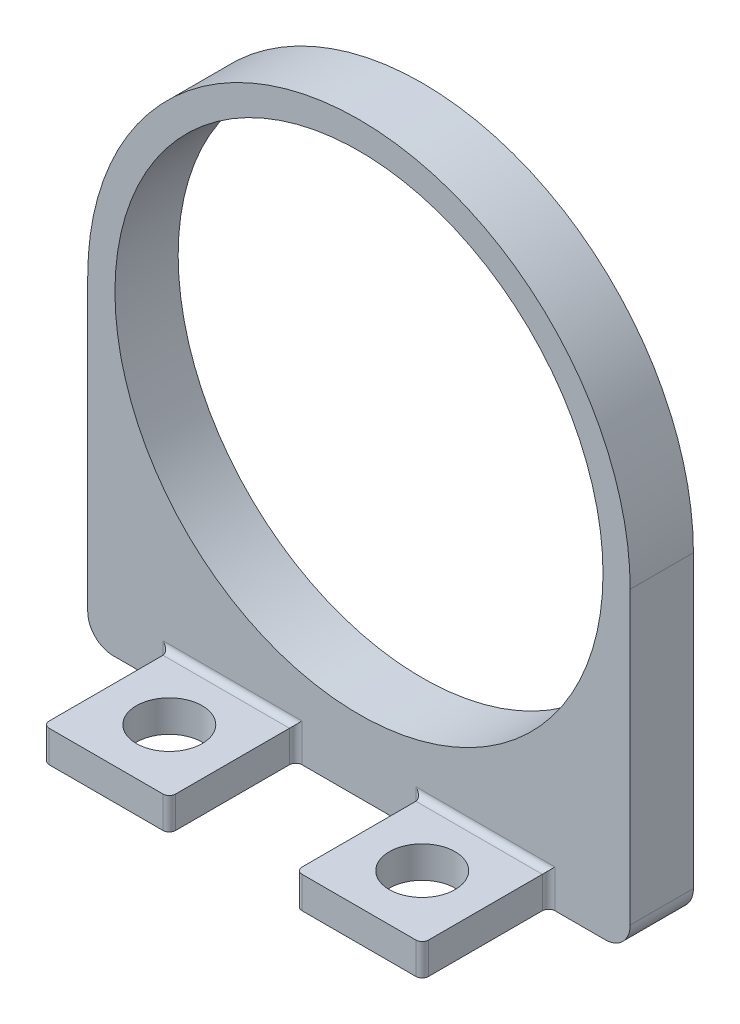
ISO-10303-21;
HEADER;
FILE_DESCRIPTION(('STEP AP214'),'2;1');
FILE_NAME('part.step','',(''),(''),'','','');
FILE_SCHEMA(('AUTOMOTIVE_DESIGN { 1 0 10303 214 1 1 1 1 }'));
ENDSEC;
DATA;
#1=APPLICATION_CONTEXT('core data for automotive mechanical design processes');
#2=APPLICATION_PROTOCOL_DEFINITION('international standard','automotive_design',2000,#1);
#3=PRODUCT_CONTEXT('',#1,'mechanical');
#4=PRODUCT('Part','Part','',(#3));
#5=PRODUCT_RELATED_PRODUCT_CATEGORY('part','',(#4));
#6=PRODUCT_DEFINITION_FORMATION('','',#4);
#7=PRODUCT_DEFINITION_CONTEXT('part definition',#1,'design');
#8=PRODUCT_DEFINITION('design','',#6,#7);
#9=PRODUCT_DEFINITION_SHAPE('','',#8);
#10=(LENGTH_UNIT() NAMED_UNIT(*) SI_UNIT(.MILLI.,.METRE.));
#11=(NAMED_UNIT(*) PLANE_ANGLE_UNIT() SI_UNIT($,.RADIAN.));
#12=(NAMED_UNIT(*) SI_UNIT($,.STERADIAN.) SOLID_ANGLE_UNIT());
#13=UNCERTAINTY_MEASURE_WITH_UNIT(LENGTH_MEASURE(1.E-05),#10,'distance_accuracy_value','');
#14=(GEOMETRIC_REPRESENTATION_CONTEXT(3) GLOBAL_UNCERTAINTY_ASSIGNED_CONTEXT((#13)) GLOBAL_UNIT_ASSIGNED_CONTEXT((#10,
#11,#12)) REPRESENTATION_CONTEXT('',''));
#15=CARTESIAN_POINT('',(0.,0.,0.));
#16=DIRECTION('',(0.,0.,1.));
#17=DIRECTION('',(1.,0.,0.));
#18=AXIS2_PLACEMENT_3D('',#15,#16,#17);
#19=CARTESIAN_POINT('',(0.,0.,6.35));
#20=DIRECTION('',(0.,0.,1.));
#21=DIRECTION('',(1.,0.,0.));
#22=AXIS2_PLACEMENT_3D('',#19,#20,#21);
#23=PLANE('',#22);
#24=DIRECTION('',(0.,-1.,0.));
#25=VECTOR('',#24,1.);
#26=CARTESIAN_POINT('',(-27.2415,0.,6.35));
#27=LINE('',#26,#25);
#28=CARTESIAN_POINT('',(-27.2415,0.,6.35));
#29=VERTEX_POINT('',#28);
#30=CARTESIAN_POINT('',(-27.2415,-29.21,6.35));
#31=VERTEX_POINT('',#30);
#32=EDGE_CURVE('E198',#29,#31,#27,.T.);
#33=ORIENTED_EDGE('',*,*,#32,.T.);
#34=CARTESIAN_POINT('',(-24.7015,-29.21,6.35));
#35=DIRECTION('',(0.,0.,1.));
#36=DIRECTION('',(1.,0.,0.));
#37=AXIS2_PLACEMENT_3D('',#34,#35,#36);
#38=CIRCLE('',#37,2.54);
#39=CARTESIAN_POINT('',(-24.7015,-31.75,6.35));
#40=VERTEX_POINT('',#39);
#41=EDGE_CURVE('E48',#31,#40,#38,.T.);
#42=ORIENTED_EDGE('',*,*,#41,.T.);
#43=DIRECTION('',(1.,0.,0.));
#44=VECTOR('',#43,1.);
#45=CARTESIAN_POINT('',(-27.2415,-31.75,6.35));
#46=LINE('',#45,#44);
#47=CARTESIAN_POINT('',(-19.685,-31.75,6.35));
#48=VERTEX_POINT('',#47);
#49=EDGE_CURVE('E331',#40,#48,#46,.T.);
#50=ORIENTED_EDGE('',*,*,#49,.T.);
#51=DIRECTION('',(0.,-1.,0.));
#52=VECTOR('',#51,1.);
#53=CARTESIAN_POINT('',(-19.685,-28.575,6.35));
#54=LINE('',#53,#52);
#55=CARTESIAN_POINT('',(-19.685,-27.94,6.35));
#56=VERTEX_POINT('',#55);
#57=EDGE_CURVE('E233',#48,#56,#54,.F.);
#58=ORIENTED_EDGE('',*,*,#57,.T.);
#59=DIRECTION('',(-1.,0.,0.));
#60=VECTOR('',#59,1.);
#61=CARTESIAN_POINT('',(-6.35,-27.94,6.35));
#62=LINE('',#61,#60);
#63=CARTESIAN_POINT('',(-5.715,-27.94,6.35));
#64=VERTEX_POINT('',#63);
#65=EDGE_CURVE('E236',#56,#64,#62,.F.);
#66=ORIENTED_EDGE('',*,*,#65,.T.);
#67=DIRECTION('',(0.,1.,0.));
#68=VECTOR('',#67,1.);
#69=CARTESIAN_POINT('',(-5.715,-31.75,6.35));
#70=LINE('',#69,#68);
#71=CARTESIAN_POINT('',(-5.715,-31.75,6.35));
#72=VERTEX_POINT('',#71);
#73=EDGE_CURVE('E239',#64,#72,#70,.F.);
#74=ORIENTED_EDGE('',*,*,#73,.T.);
#75=CARTESIAN_POINT('',(5.715,-31.75,6.35));
#76=VERTEX_POINT('',#75);
#77=EDGE_CURVE('E341',#72,#76,#46,.T.);
#78=ORIENTED_EDGE('',*,*,#77,.T.);
#79=DIRECTION('',(0.,-1.,0.));
#80=VECTOR('',#79,1.);
#81=CARTESIAN_POINT('',(5.715,-28.575,6.35));
#82=LINE('',#81,#80);
#83=CARTESIAN_POINT('',(5.715,-27.94,6.35));
#84=VERTEX_POINT('',#83);
#85=EDGE_CURVE('E245',#76,#84,#82,.F.);
#86=ORIENTED_EDGE('',*,*,#85,.T.);
#87=DIRECTION('',(1.,0.,0.));
#88=VECTOR('',#87,1.);
#89=CARTESIAN_POINT('',(0.,-27.94,6.35));
#90=LINE('',#89,#88);
#91=CARTESIAN_POINT('',(19.685,-27.94,6.35));
#92=VERTEX_POINT('',#91);
#93=EDGE_CURVE('E243',#84,#92,#90,.T.);
#94=ORIENTED_EDGE('',*,*,#93,.T.);
#95=DIRECTION('',(0.,1.,0.));
#96=VECTOR('',#95,1.);
#97=CARTESIAN_POINT('',(19.685,-31.75,6.35));
#98=LINE('',#97,#96);
#99=CARTESIAN_POINT('',(19.685,-31.75,6.35));
#100=VERTEX_POINT('',#99);
#101=EDGE_CURVE('E241',#92,#100,#98,.F.);
#102=ORIENTED_EDGE('',*,*,#101,.T.);
#103=CARTESIAN_POINT('',(24.7015,-31.75,6.35));
#104=VERTEX_POINT('',#103);
#105=EDGE_CURVE('E206',#100,#104,#46,.T.);
#106=ORIENTED_EDGE('',*,*,#105,.T.);
#107=CARTESIAN_POINT('',(24.7015,-29.21,6.35));
#108=DIRECTION('',(0.,0.,1.));
#109=DIRECTION('',(1.,0.,0.));
#110=AXIS2_PLACEMENT_3D('',#107,#108,#109);
#111=CIRCLE('',#110,2.54);
#112=CARTESIAN_POINT('',(27.2415,-29.21,6.35));
#113=VERTEX_POINT('',#112);
#114=EDGE_CURVE('E55',#104,#113,#111,.T.);
#115=ORIENTED_EDGE('',*,*,#114,.T.);
#116=DIRECTION('',(0.,1.,0.));
#117=VECTOR('',#116,1.);
#118=CARTESIAN_POINT('',(27.2415,-31.75,6.35));
#119=LINE('',#118,#117);
#120=CARTESIAN_POINT('',(27.2415,0.,6.35));
#121=VERTEX_POINT('',#120);
#122=EDGE_CURVE('E211',#113,#121,#119,.T.);
#123=ORIENTED_EDGE('',*,*,#122,.T.);
#124=CARTESIAN_POINT('',(0.,0.,6.35));
#125=DIRECTION('',(0.,0.,1.));
#126=DIRECTION('',(1.,0.,0.));
#127=AXIS2_PLACEMENT_3D('',#124,#125,#126);
#128=CIRCLE('',#127,27.2415);
#129=EDGE_CURVE('E207',#121,#29,#128,.T.);
#130=ORIENTED_EDGE('',*,*,#129,.T.);
#131=EDGE_LOOP('',(#33,#42,#50,#58,#66,#74,#78,#86,#94,#102,#106,#115,#123,#130));
#132=FACE_BOUND('',#131,.T.);
#133=CARTESIAN_POINT('',(0.,0.,6.35));
#134=DIRECTION('',(0.,0.,1.));
#135=DIRECTION('',(1.,0.,0.));
#136=AXIS2_PLACEMENT_3D('',#133,#134,#135);
#137=CIRCLE('',#136,24.511);
#138=CARTESIAN_POINT('',(24.511,0.,6.35));
#139=VERTEX_POINT('',#138);
#140=EDGE_CURVE('E354',#139,#139,#137,.T.);
#141=ORIENTED_EDGE('',*,*,#140,.F.);
#142=EDGE_LOOP('',(#141));
#143=FACE_BOUND('',#142,.T.);
#144=ADVANCED_FACE('F40',(#132,#143),#23,.T.);
#145=CARTESIAN_POINT('',(0.,0.,0.));
#146=DIRECTION('',(0.,0.,1.));
#147=DIRECTION('',(1.,0.,0.));
#148=AXIS2_PLACEMENT_3D('',#145,#146,#147);
#149=PLANE('',#148);
#150=DIRECTION('',(1.,0.,0.));
#151=VECTOR('',#150,1.);
#152=CARTESIAN_POINT('',(-27.2415,-31.75,0.));
#153=LINE('',#152,#151);
#154=CARTESIAN_POINT('',(-24.7015,-31.75,0.));
#155=VERTEX_POINT('',#154);
#156=CARTESIAN_POINT('',(24.7015,-31.75,0.));
#157=VERTEX_POINT('',#156);
#158=EDGE_CURVE('E348',#155,#157,#153,.T.);
#159=ORIENTED_EDGE('',*,*,#158,.F.);
#160=CARTESIAN_POINT('',(-24.7015,-29.21,0.));
#161=DIRECTION('',(0.,0.,1.));
#162=DIRECTION('',(1.,0.,0.));
#163=AXIS2_PLACEMENT_3D('',#160,#161,#162);
#164=CIRCLE('',#163,2.54);
#165=CARTESIAN_POINT('',(-27.2415,-29.21,0.));
#166=VERTEX_POINT('',#165);
#167=EDGE_CURVE('E327',#155,#166,#164,.F.);
#168=ORIENTED_EDGE('',*,*,#167,.T.);
#169=DIRECTION('',(0.,-1.,0.));
#170=VECTOR('',#169,1.);
#171=CARTESIAN_POINT('',(-27.2415,0.,0.));
#172=LINE('',#171,#170);
#173=CARTESIAN_POINT('',(-27.2415,0.,0.));
#174=VERTEX_POINT('',#173);
#175=EDGE_CURVE('E347',#174,#166,#172,.T.);
#176=ORIENTED_EDGE('',*,*,#175,.F.);
#177=CARTESIAN_POINT('',(0.,0.,0.));
#178=DIRECTION('',(0.,0.,1.));
#179=DIRECTION('',(1.,0.,0.));
#180=AXIS2_PLACEMENT_3D('',#177,#178,#179);
#181=CIRCLE('',#180,27.2415);
#182=CARTESIAN_POINT('',(27.2415,0.,0.));
#183=VERTEX_POINT('',#182);
#184=EDGE_CURVE('E220',#183,#174,#181,.T.);
#185=ORIENTED_EDGE('',*,*,#184,.F.);
#186=DIRECTION('',(0.,1.,0.));
#187=VECTOR('',#186,1.);
#188=CARTESIAN_POINT('',(27.2415,-31.75,0.));
#189=LINE('',#188,#187);
#190=CARTESIAN_POINT('',(27.2415,-29.21,0.));
#191=VERTEX_POINT('',#190);
#192=EDGE_CURVE('E216',#191,#183,#189,.T.);
#193=ORIENTED_EDGE('',*,*,#192,.F.);
#194=CARTESIAN_POINT('',(24.7015,-29.21,0.));
#195=DIRECTION('',(0.,0.,1.));
#196=DIRECTION('',(1.,0.,0.));
#197=AXIS2_PLACEMENT_3D('',#194,#195,#196);
#198=CIRCLE('',#197,2.54);
#199=EDGE_CURVE('E325',#191,#157,#198,.F.);
#200=ORIENTED_EDGE('',*,*,#199,.T.);
#201=EDGE_LOOP('',(#159,#168,#176,#185,#193,#200));
#202=FACE_BOUND('',#201,.T.);
#203=CARTESIAN_POINT('',(0.,0.,0.));
#204=DIRECTION('',(0.,0.,1.));
#205=DIRECTION('',(1.,0.,0.));
#206=AXIS2_PLACEMENT_3D('',#203,#204,#205);
#207=CIRCLE('',#206,24.511);
#208=CARTESIAN_POINT('',(24.511,0.,0.));
#209=VERTEX_POINT('',#208);
#210=EDGE_CURVE('E461',#209,#209,#207,.T.);
#211=ORIENTED_EDGE('',*,*,#210,.T.);
#212=EDGE_LOOP('',(#211));
#213=FACE_BOUND('',#212,.T.);
#214=ADVANCED_FACE('F345',(#202,#213),#149,.F.);
#215=CARTESIAN_POINT('',(0.,0.,6.35));
#216=DIRECTION('',(0.,0.,-1.));
#217=DIRECTION('',(-1.,0.,0.));
#218=AXIS2_PLACEMENT_3D('',#215,#216,#217);
#219=CYLINDRICAL_SURFACE('',#218,27.2415);
#220=ORIENTED_EDGE('',*,*,#184,.T.);
#221=DIRECTION('',(0.,0.,-1.));
#222=VECTOR('',#221,1.);
#223=CARTESIAN_POINT('',(-27.2415,0.,6.35));
#224=LINE('',#223,#222);
#225=EDGE_CURVE('E202',#29,#174,#224,.T.);
#226=ORIENTED_EDGE('',*,*,#225,.F.);
#227=ORIENTED_EDGE('',*,*,#129,.F.);
#228=DIRECTION('',(0.,0.,-1.));
#229=VECTOR('',#228,1.);
#230=CARTESIAN_POINT('',(27.2415,0.,6.35));
#231=LINE('',#230,#229);
#232=EDGE_CURVE('E223',#121,#183,#231,.T.);
#233=ORIENTED_EDGE('',*,*,#232,.T.);
#234=EDGE_LOOP('',(#220,#226,#227,#233));
#235=FACE_BOUND('',#234,.T.);
#236=ADVANCED_FACE('F218',(#235),#219,.T.);
#237=CARTESIAN_POINT('',(-27.2415,0.,6.35));
#238=DIRECTION('',(1.,0.,0.));
#239=DIRECTION('',(0.,0.,-1.));
#240=AXIS2_PLACEMENT_3D('',#237,#238,#239);
#241=PLANE('',#240);
#242=ORIENTED_EDGE('',*,*,#175,.T.);
#243=DIRECTION('',(0.,0.,-1.));
#244=VECTOR('',#243,1.);
#245=CARTESIAN_POINT('',(-27.2415,-29.21,6.35));
#246=LINE('',#245,#244);
#247=EDGE_CURVE('E63',#166,#31,#246,.F.);
#248=ORIENTED_EDGE('',*,*,#247,.T.);
#249=ORIENTED_EDGE('',*,*,#32,.F.);
#250=ORIENTED_EDGE('',*,*,#225,.T.);
#251=EDGE_LOOP('',(#242,#248,#249,#250));
#252=FACE_BOUND('',#251,.T.);
#253=ADVANCED_FACE('F200',(#252),#241,.F.);
#254=CARTESIAN_POINT('',(-27.2415,-31.75,6.35));
#255=DIRECTION('',(0.,1.,0.));
#256=DIRECTION('',(0.,0.,1.));
#257=AXIS2_PLACEMENT_3D('',#254,#255,#256);
#258=PLANE('',#257);
#259=CARTESIAN_POINT('',(12.7,-31.75,12.7));
#260=DIRECTION('',(0.,1.,0.));
#261=DIRECTION('',(0.,0.,1.));
#262=AXIS2_PLACEMENT_3D('',#259,#260,#261);
#263=CIRCLE('',#262,3.302);
#264=CARTESIAN_POINT('',(12.7,-31.75,16.002));
#265=VERTEX_POINT('',#264);
#266=EDGE_CURVE('E523',#265,#265,#263,.T.);
#267=ORIENTED_EDGE('',*,*,#266,.T.);
#268=EDGE_LOOP('',(#267));
#269=FACE_BOUND('',#268,.T.);
#270=CARTESIAN_POINT('',(-12.7,-31.75,12.7));
#271=DIRECTION('',(0.,1.,0.));
#272=DIRECTION('',(0.,0.,1.));
#273=AXIS2_PLACEMENT_3D('',#270,#271,#272);
#274=CIRCLE('',#273,3.302);
#275=CARTESIAN_POINT('',(-12.7,-31.75,16.002));
#276=VERTEX_POINT('',#275);
#277=EDGE_CURVE('E530',#276,#276,#274,.T.);
#278=ORIENTED_EDGE('',*,*,#277,.T.);
#279=EDGE_LOOP('',(#278));
#280=FACE_BOUND('',#279,.T.);
#281=ORIENTED_EDGE('',*,*,#49,.F.);
#282=DIRECTION('',(0.,0.,-1.));
#283=VECTOR('',#282,1.);
#284=CARTESIAN_POINT('',(-24.7015,-31.75,6.35));
#285=LINE('',#284,#283);
#286=EDGE_CURVE('E322',#40,#155,#285,.T.);
#287=ORIENTED_EDGE('',*,*,#286,.T.);
#288=ORIENTED_EDGE('',*,*,#158,.T.);
#289=DIRECTION('',(0.,0.,-1.));
#290=VECTOR('',#289,1.);
#291=CARTESIAN_POINT('',(24.7015,-31.75,6.35));
#292=LINE('',#291,#290);
#293=EDGE_CURVE('E307',#157,#104,#292,.F.);
#294=ORIENTED_EDGE('',*,*,#293,.T.);
#295=ORIENTED_EDGE('',*,*,#105,.F.);
#296=CARTESIAN_POINT('',(19.685,-31.75,6.985));
#297=DIRECTION('',(0.,1.,0.));
#298=DIRECTION('',(0.,0.,1.));
#299=AXIS2_PLACEMENT_3D('',#296,#297,#298);
#300=CIRCLE('',#299,0.635);
#301=CARTESIAN_POINT('',(19.05,-31.75,6.985));
#302=VERTEX_POINT('',#301);
#303=EDGE_CURVE('E300',#100,#302,#300,.T.);
#304=ORIENTED_EDGE('',*,*,#303,.T.);
#305=DIRECTION('',(0.,0.,1.));
#306=VECTOR('',#305,1.);
#307=CARTESIAN_POINT('',(19.05,-31.75,0.));
#308=LINE('',#307,#306);
#309=CARTESIAN_POINT('',(19.05,-31.75,18.415));
#310=VERTEX_POINT('',#309);
#311=EDGE_CURVE('E534',#302,#310,#308,.T.);
#312=ORIENTED_EDGE('',*,*,#311,.T.);
#313=CARTESIAN_POINT('',(18.415,-31.75,18.415));
#314=DIRECTION('',(0.,1.,0.));
#315=DIRECTION('',(0.,0.,1.));
#316=AXIS2_PLACEMENT_3D('',#313,#314,#315);
#317=CIRCLE('',#316,0.635);
#318=CARTESIAN_POINT('',(18.415,-31.75,19.05));
#319=VERTEX_POINT('',#318);
#320=EDGE_CURVE('E265',#310,#319,#317,.F.);
#321=ORIENTED_EDGE('',*,*,#320,.T.);
#322=DIRECTION('',(-1.,0.,0.));
#323=VECTOR('',#322,1.);
#324=CARTESIAN_POINT('',(19.05,-31.75,19.05));
#325=LINE('',#324,#323);
#326=CARTESIAN_POINT('',(6.985,-31.75,19.05));
#327=VERTEX_POINT('',#326);
#328=EDGE_CURVE('E546',#319,#327,#325,.T.);
#329=ORIENTED_EDGE('',*,*,#328,.T.);
#330=CARTESIAN_POINT('',(6.985,-31.75,18.415));
#331=DIRECTION('',(0.,1.,0.));
#332=DIRECTION('',(0.,0.,1.));
#333=AXIS2_PLACEMENT_3D('',#330,#331,#332);
#334=CIRCLE('',#333,0.635);
#335=CARTESIAN_POINT('',(6.35,-31.75,18.415));
#336=VERTEX_POINT('',#335);
#337=EDGE_CURVE('E263',#327,#336,#334,.F.);
#338=ORIENTED_EDGE('',*,*,#337,.T.);
#339=DIRECTION('',(0.,0.,-1.));
#340=VECTOR('',#339,1.);
#341=CARTESIAN_POINT('',(6.35,-31.75,0.));
#342=LINE('',#341,#340);
#343=CARTESIAN_POINT('',(6.35,-31.75,6.985));
#344=VERTEX_POINT('',#343);
#345=EDGE_CURVE('E455',#336,#344,#342,.T.);
#346=ORIENTED_EDGE('',*,*,#345,.T.);
#347=CARTESIAN_POINT('',(5.715,-31.75,6.985));
#348=DIRECTION('',(0.,1.,0.));
#349=DIRECTION('',(0.,0.,1.));
#350=AXIS2_PLACEMENT_3D('',#347,#348,#349);
#351=CIRCLE('',#350,0.635);
#352=EDGE_CURVE('E298',#344,#76,#351,.T.);
#353=ORIENTED_EDGE('',*,*,#352,.T.);
#354=ORIENTED_EDGE('',*,*,#77,.F.);
#355=CARTESIAN_POINT('',(-5.715,-31.75,6.985));
#356=DIRECTION('',(0.,1.,0.));
#357=DIRECTION('',(0.,0.,1.));
#358=AXIS2_PLACEMENT_3D('',#355,#356,#357);
#359=CIRCLE('',#358,0.635);
#360=CARTESIAN_POINT('',(-6.35,-31.75,6.985));
#361=VERTEX_POINT('',#360);
#362=EDGE_CURVE('E302',#72,#361,#359,.T.);
#363=ORIENTED_EDGE('',*,*,#362,.T.);
#364=DIRECTION('',(0.,0.,1.));
#365=VECTOR('',#364,1.);
#366=CARTESIAN_POINT('',(-6.35,-31.75,0.));
#367=LINE('',#366,#365);
#368=CARTESIAN_POINT('',(-6.35,-31.75,18.415));
#369=VERTEX_POINT('',#368);
#370=EDGE_CURVE('E462',#361,#369,#367,.T.);
#371=ORIENTED_EDGE('',*,*,#370,.T.);
#372=CARTESIAN_POINT('',(-6.985,-31.75,18.415));
#373=DIRECTION('',(0.,1.,0.));
#374=DIRECTION('',(0.,0.,1.));
#375=AXIS2_PLACEMENT_3D('',#372,#373,#374);
#376=CIRCLE('',#375,0.635);
#377=CARTESIAN_POINT('',(-6.985,-31.75,19.05));
#378=VERTEX_POINT('',#377);
#379=EDGE_CURVE('E258',#369,#378,#376,.F.);
#380=ORIENTED_EDGE('',*,*,#379,.T.);
#381=DIRECTION('',(-1.,0.,0.));
#382=VECTOR('',#381,1.);
#383=CARTESIAN_POINT('',(-19.05,-31.75,19.05));
#384=LINE('',#383,#382);
#385=CARTESIAN_POINT('',(-18.415,-31.75,19.05));
#386=VERTEX_POINT('',#385);
#387=EDGE_CURVE('E452',#378,#386,#384,.T.);
#388=ORIENTED_EDGE('',*,*,#387,.T.);
#389=CARTESIAN_POINT('',(-18.415,-31.75,18.415));
#390=DIRECTION('',(0.,1.,0.));
#391=DIRECTION('',(0.,0.,1.));
#392=AXIS2_PLACEMENT_3D('',#389,#390,#391);
#393=CIRCLE('',#392,0.635);
#394=CARTESIAN_POINT('',(-19.05,-31.75,18.415));
#395=VERTEX_POINT('',#394);
#396=EDGE_CURVE('E261',#386,#395,#393,.F.);
#397=ORIENTED_EDGE('',*,*,#396,.T.);
#398=DIRECTION('',(0.,0.,-1.));
#399=VECTOR('',#398,1.);
#400=CARTESIAN_POINT('',(-19.05,-31.75,0.));
#401=LINE('',#400,#399);
#402=CARTESIAN_POINT('',(-19.05,-31.75,6.985));
#403=VERTEX_POINT('',#402);
#404=EDGE_CURVE('E448',#395,#403,#401,.T.);
#405=ORIENTED_EDGE('',*,*,#404,.T.);
#406=CARTESIAN_POINT('',(-19.685,-31.75,6.985));
#407=DIRECTION('',(0.,1.,0.));
#408=DIRECTION('',(0.,0.,1.));
#409=AXIS2_PLACEMENT_3D('',#406,#407,#408);
#410=CIRCLE('',#409,0.635);
#411=EDGE_CURVE('E304',#403,#48,#410,.T.);
#412=ORIENTED_EDGE('',*,*,#411,.T.);
#413=EDGE_LOOP('',(#281,#287,#288,#294,#295,#304,#312,#321,#329,#338,#346,#353,#354,#363,#371,
#380,#388,#397,#405,#412));
#414=FACE_BOUND('',#413,.T.);
#415=ADVANCED_FACE('F335',(#269,#280,#414),#258,.F.);
#416=CARTESIAN_POINT('',(27.2415,-31.75,6.35));
#417=DIRECTION('',(-1.,0.,0.));
#418=DIRECTION('',(0.,0.,1.));
#419=AXIS2_PLACEMENT_3D('',#416,#417,#418);
#420=PLANE('',#419);
#421=ORIENTED_EDGE('',*,*,#122,.F.);
#422=DIRECTION('',(0.,0.,-1.));
#423=VECTOR('',#422,1.);
#424=CARTESIAN_POINT('',(27.2415,-29.21,6.35));
#425=LINE('',#424,#423);
#426=EDGE_CURVE('E11',#113,#191,#425,.T.);
#427=ORIENTED_EDGE('',*,*,#426,.T.);
#428=ORIENTED_EDGE('',*,*,#192,.T.);
#429=ORIENTED_EDGE('',*,*,#232,.F.);
#430=EDGE_LOOP('',(#421,#427,#428,#429));
#431=FACE_BOUND('',#430,.T.);
#432=ADVANCED_FACE('F361',(#431),#420,.F.);
#433=CARTESIAN_POINT('',(0.,0.,6.35));
#434=DIRECTION('',(0.,0.,-1.));
#435=DIRECTION('',(-1.,0.,0.));
#436=AXIS2_PLACEMENT_3D('',#433,#434,#435);
#437=CYLINDRICAL_SURFACE('',#436,24.511);
#438=ORIENTED_EDGE('',*,*,#140,.T.);
#439=EDGE_LOOP('',(#438));
#440=FACE_BOUND('',#439,.T.);
#441=ORIENTED_EDGE('',*,*,#210,.F.);
#442=EDGE_LOOP('',(#441));
#443=FACE_BOUND('',#442,.T.);
#444=ADVANCED_FACE('F378',(#440,#443),#437,.F.);
#445=CARTESIAN_POINT('',(-6.35,-28.575,0.));
#446=DIRECTION('',(1.,0.,0.));
#447=DIRECTION('',(0.,0.,-1.));
#448=AXIS2_PLACEMENT_3D('',#445,#446,#447);
#449=PLANE('',#448);
#450=ORIENTED_EDGE('',*,*,#370,.F.);
#451=DIRECTION('',(0.,1.,0.));
#452=VECTOR('',#451,1.);
#453=CARTESIAN_POINT('',(-6.35,-28.575,6.985));
#454=LINE('',#453,#452);
#455=CARTESIAN_POINT('',(-6.35,-28.575,6.985));
#456=VERTEX_POINT('',#455);
#457=EDGE_CURVE('E276',#361,#456,#454,.T.);
#458=ORIENTED_EDGE('',*,*,#457,.T.);
#459=DIRECTION('',(0.,0.,1.));
#460=VECTOR('',#459,1.);
#461=CARTESIAN_POINT('',(-6.35,-28.575,0.));
#462=LINE('',#461,#460);
#463=CARTESIAN_POINT('',(-6.35,-28.575,18.415));
#464=VERTEX_POINT('',#463);
#465=EDGE_CURVE('E439',#456,#464,#462,.T.);
#466=ORIENTED_EDGE('',*,*,#465,.T.);
#467=DIRECTION('',(0.,-1.,0.));
#468=VECTOR('',#467,1.);
#469=CARTESIAN_POINT('',(-6.35,-28.575,18.415));
#470=LINE('',#469,#468);
#471=EDGE_CURVE('E272',#464,#369,#470,.T.);
#472=ORIENTED_EDGE('',*,*,#471,.T.);
#473=EDGE_LOOP('',(#450,#458,#466,#472));
#474=FACE_BOUND('',#473,.T.);
#475=ADVANCED_FACE('F444',(#474),#449,.T.);
#476=CARTESIAN_POINT('',(-19.05,-28.575,0.));
#477=DIRECTION('',(-1.,0.,0.));
#478=DIRECTION('',(0.,0.,1.));
#479=AXIS2_PLACEMENT_3D('',#476,#477,#478);
#480=PLANE('',#479);
#481=DIRECTION('',(0.,0.,-1.));
#482=VECTOR('',#481,1.);
#483=CARTESIAN_POINT('',(-19.05,-28.575,0.));
#484=LINE('',#483,#482);
#485=CARTESIAN_POINT('',(-19.05,-28.575,18.415));
#486=VERTEX_POINT('',#485);
#487=CARTESIAN_POINT('',(-19.05,-28.575,6.985));
#488=VERTEX_POINT('',#487);
#489=EDGE_CURVE('E450',#486,#488,#484,.T.);
#490=ORIENTED_EDGE('',*,*,#489,.T.);
#491=DIRECTION('',(0.,-1.,0.));
#492=VECTOR('',#491,1.);
#493=CARTESIAN_POINT('',(-19.05,-31.75,6.985));
#494=LINE('',#493,#492);
#495=EDGE_CURVE('E289',#488,#403,#494,.T.);
#496=ORIENTED_EDGE('',*,*,#495,.T.);
#497=ORIENTED_EDGE('',*,*,#404,.F.);
#498=DIRECTION('',(0.,-1.,0.));
#499=VECTOR('',#498,1.);
#500=CARTESIAN_POINT('',(-19.05,-28.575,18.415));
#501=LINE('',#500,#499);
#502=EDGE_CURVE('E287',#395,#486,#501,.F.);
#503=ORIENTED_EDGE('',*,*,#502,.T.);
#504=EDGE_LOOP('',(#490,#496,#497,#503));
#505=FACE_BOUND('',#504,.T.);
#506=ADVANCED_FACE('F481',(#505),#480,.T.);
#507=CARTESIAN_POINT('',(-19.05,-28.575,19.05));
#508=DIRECTION('',(0.,0.,1.));
#509=DIRECTION('',(1.,0.,0.));
#510=AXIS2_PLACEMENT_3D('',#507,#508,#509);
#511=PLANE('',#510);
#512=DIRECTION('',(-1.,0.,0.));
#513=VECTOR('',#512,1.);
#514=CARTESIAN_POINT('',(-19.05,-28.575,19.05));
#515=LINE('',#514,#513);
#516=CARTESIAN_POINT('',(-6.985,-28.575,19.05));
#517=VERTEX_POINT('',#516);
#518=CARTESIAN_POINT('',(-18.415,-28.575,19.05));
#519=VERTEX_POINT('',#518);
#520=EDGE_CURVE('E441',#517,#519,#515,.T.);
#521=ORIENTED_EDGE('',*,*,#520,.T.);
#522=DIRECTION('',(0.,-1.,0.));
#523=VECTOR('',#522,1.);
#524=CARTESIAN_POINT('',(-18.415,-28.575,19.05));
#525=LINE('',#524,#523);
#526=EDGE_CURVE('E295',#519,#386,#525,.T.);
#527=ORIENTED_EDGE('',*,*,#526,.T.);
#528=ORIENTED_EDGE('',*,*,#387,.F.);
#529=DIRECTION('',(0.,-1.,0.));
#530=VECTOR('',#529,1.);
#531=CARTESIAN_POINT('',(-6.985,-28.575,19.05));
#532=LINE('',#531,#530);
#533=EDGE_CURVE('E292',#378,#517,#532,.F.);
#534=ORIENTED_EDGE('',*,*,#533,.T.);
#535=EDGE_LOOP('',(#521,#527,#528,#534));
#536=FACE_BOUND('',#535,.T.);
#537=ADVANCED_FACE('F486',(#536),#511,.T.);
#538=CARTESIAN_POINT('',(0.,-28.575,0.));
#539=DIRECTION('',(0.,1.,0.));
#540=DIRECTION('',(0.,0.,1.));
#541=AXIS2_PLACEMENT_3D('',#538,#539,#540);
#542=PLANE('',#541);
#543=CARTESIAN_POINT('',(-12.7,-28.575,12.7));
#544=DIRECTION('',(0.,1.,0.));
#545=DIRECTION('',(0.,0.,1.));
#546=AXIS2_PLACEMENT_3D('',#543,#544,#545);
#547=CIRCLE('',#546,3.302);
#548=CARTESIAN_POINT('',(-12.7,-28.575,16.002));
#549=VERTEX_POINT('',#548);
#550=EDGE_CURVE('E527',#549,#549,#547,.T.);
#551=ORIENTED_EDGE('',*,*,#550,.F.);
#552=EDGE_LOOP('',(#551));
#553=FACE_BOUND('',#552,.T.);
#554=ORIENTED_EDGE('',*,*,#465,.F.);
#555=DIRECTION('',(-1.,0.,0.));
#556=VECTOR('',#555,1.);
#557=CARTESIAN_POINT('',(-19.05,-28.575,6.985));
#558=LINE('',#557,#556);
#559=EDGE_CURVE('E284',#456,#488,#558,.T.);
#560=ORIENTED_EDGE('',*,*,#559,.T.);
#561=ORIENTED_EDGE('',*,*,#489,.F.);
#562=CARTESIAN_POINT('',(-18.415,-28.575,18.415));
#563=DIRECTION('',(0.,1.,0.));
#564=DIRECTION('',(0.,0.,1.));
#565=AXIS2_PLACEMENT_3D('',#562,#563,#564);
#566=CIRCLE('',#565,0.635);
#567=EDGE_CURVE('E282',#486,#519,#566,.T.);
#568=ORIENTED_EDGE('',*,*,#567,.T.);
#569=ORIENTED_EDGE('',*,*,#520,.F.);
#570=CARTESIAN_POINT('',(-6.985,-28.575,18.415));
#571=DIRECTION('',(0.,1.,0.));
#572=DIRECTION('',(0.,0.,1.));
#573=AXIS2_PLACEMENT_3D('',#570,#571,#572);
#574=CIRCLE('',#573,0.635);
#575=EDGE_CURVE('E279',#517,#464,#574,.T.);
#576=ORIENTED_EDGE('',*,*,#575,.T.);
#577=EDGE_LOOP('',(#554,#560,#561,#568,#569,#576));
#578=FACE_BOUND('',#577,.T.);
#579=ADVANCED_FACE('F438',(#553,#578),#542,.T.);
#580=CARTESIAN_POINT('',(19.05,-28.575,0.));
#581=DIRECTION('',(1.,0.,0.));
#582=DIRECTION('',(0.,0.,-1.));
#583=AXIS2_PLACEMENT_3D('',#580,#581,#582);
#584=PLANE('',#583);
#585=ORIENTED_EDGE('',*,*,#311,.F.);
#586=DIRECTION('',(0.,1.,0.));
#587=VECTOR('',#586,1.);
#588=CARTESIAN_POINT('',(19.05,-28.575,6.985));
#589=LINE('',#588,#587);
#590=CARTESIAN_POINT('',(19.05,-28.575,6.985));
#591=VERTEX_POINT('',#590);
#592=EDGE_CURVE('E256',#302,#591,#589,.T.);
#593=ORIENTED_EDGE('',*,*,#592,.T.);
#594=DIRECTION('',(0.,0.,1.));
#595=VECTOR('',#594,1.);
#596=CARTESIAN_POINT('',(19.05,-28.575,0.));
#597=LINE('',#596,#595);
#598=CARTESIAN_POINT('',(19.05,-28.575,18.415));
#599=VERTEX_POINT('',#598);
#600=EDGE_CURVE('E537',#591,#599,#597,.T.);
#601=ORIENTED_EDGE('',*,*,#600,.T.);
#602=DIRECTION('',(0.,-1.,0.));
#603=VECTOR('',#602,1.);
#604=CARTESIAN_POINT('',(19.05,-28.575,18.415));
#605=LINE('',#604,#603);
#606=EDGE_CURVE('E253',#599,#310,#605,.T.);
#607=ORIENTED_EDGE('',*,*,#606,.T.);
#608=EDGE_LOOP('',(#585,#593,#601,#607));
#609=FACE_BOUND('',#608,.T.);
#610=ADVANCED_FACE('F495',(#609),#584,.T.);
#611=CARTESIAN_POINT('',(6.35,-28.575,0.));
#612=DIRECTION('',(-1.,0.,0.));
#613=DIRECTION('',(0.,0.,1.));
#614=AXIS2_PLACEMENT_3D('',#611,#612,#613);
#615=PLANE('',#614);
#616=DIRECTION('',(0.,0.,-1.));
#617=VECTOR('',#616,1.);
#618=CARTESIAN_POINT('',(6.35,-28.575,0.));
#619=LINE('',#618,#617);
#620=CARTESIAN_POINT('',(6.35,-28.575,18.415));
#621=VERTEX_POINT('',#620);
#622=CARTESIAN_POINT('',(6.35,-28.575,6.985));
#623=VERTEX_POINT('',#622);
#624=EDGE_CURVE('E465',#621,#623,#619,.T.);
#625=ORIENTED_EDGE('',*,*,#624,.T.);
#626=DIRECTION('',(0.,-1.,0.));
#627=VECTOR('',#626,1.);
#628=CARTESIAN_POINT('',(6.35,-31.75,6.985));
#629=LINE('',#628,#627);
#630=EDGE_CURVE('E225',#623,#344,#629,.T.);
#631=ORIENTED_EDGE('',*,*,#630,.T.);
#632=ORIENTED_EDGE('',*,*,#345,.F.);
#633=DIRECTION('',(0.,-1.,0.));
#634=VECTOR('',#633,1.);
#635=CARTESIAN_POINT('',(6.35,-28.575,18.415));
#636=LINE('',#635,#634);
#637=EDGE_CURVE('E222',#336,#621,#636,.F.);
#638=ORIENTED_EDGE('',*,*,#637,.T.);
#639=EDGE_LOOP('',(#625,#631,#632,#638));
#640=FACE_BOUND('',#639,.T.);
#641=ADVANCED_FACE('F499',(#640),#615,.T.);
#642=CARTESIAN_POINT('',(19.05,-28.575,19.05));
#643=DIRECTION('',(0.,0.,1.));
#644=DIRECTION('',(1.,0.,0.));
#645=AXIS2_PLACEMENT_3D('',#642,#643,#644);
#646=PLANE('',#645);
#647=ORIENTED_EDGE('',*,*,#328,.F.);
#648=DIRECTION('',(0.,-1.,0.));
#649=VECTOR('',#648,1.);
#650=CARTESIAN_POINT('',(18.415,-28.575,19.05));
#651=LINE('',#650,#649);
#652=CARTESIAN_POINT('',(18.415,-28.575,19.05));
#653=VERTEX_POINT('',#652);
#654=EDGE_CURVE('E270',#319,#653,#651,.F.);
#655=ORIENTED_EDGE('',*,*,#654,.T.);
#656=DIRECTION('',(-1.,0.,0.));
#657=VECTOR('',#656,1.);
#658=CARTESIAN_POINT('',(19.05,-28.575,19.05));
#659=LINE('',#658,#657);
#660=CARTESIAN_POINT('',(6.985,-28.575,19.05));
#661=VERTEX_POINT('',#660);
#662=EDGE_CURVE('E540',#653,#661,#659,.T.);
#663=ORIENTED_EDGE('',*,*,#662,.T.);
#664=DIRECTION('',(0.,-1.,0.));
#665=VECTOR('',#664,1.);
#666=CARTESIAN_POINT('',(6.985,-28.575,19.05));
#667=LINE('',#666,#665);
#668=EDGE_CURVE('E267',#661,#327,#667,.T.);
#669=ORIENTED_EDGE('',*,*,#668,.T.);
#670=EDGE_LOOP('',(#647,#655,#663,#669));
#671=FACE_BOUND('',#670,.T.);
#672=ADVANCED_FACE('F501',(#671),#646,.T.);
#673=CARTESIAN_POINT('',(0.,-28.575,0.));
#674=DIRECTION('',(0.,-1.,0.));
#675=DIRECTION('',(0.,0.,-1.));
#676=AXIS2_PLACEMENT_3D('',#673,#674,#675);
#677=PLANE('',#676);
#678=CARTESIAN_POINT('',(12.7,-28.575,12.7));
#679=DIRECTION('',(0.,1.,0.));
#680=DIRECTION('',(0.,0.,1.));
#681=AXIS2_PLACEMENT_3D('',#678,#679,#680);
#682=CIRCLE('',#681,3.302);
#683=CARTESIAN_POINT('',(12.7,-28.575,16.002));
#684=VERTEX_POINT('',#683);
#685=EDGE_CURVE('E315',#684,#684,#682,.T.);
#686=ORIENTED_EDGE('',*,*,#685,.F.);
#687=EDGE_LOOP('',(#686));
#688=FACE_BOUND('',#687,.T.);
#689=ORIENTED_EDGE('',*,*,#600,.F.);
#690=DIRECTION('',(1.,0.,0.));
#691=VECTOR('',#690,1.);
#692=CARTESIAN_POINT('',(0.,-28.575,6.985));
#693=LINE('',#692,#691);
#694=EDGE_CURVE('E251',#591,#623,#693,.F.);
#695=ORIENTED_EDGE('',*,*,#694,.T.);
#696=ORIENTED_EDGE('',*,*,#624,.F.);
#697=CARTESIAN_POINT('',(6.985,-28.575,18.415));
#698=DIRECTION('',(0.,-1.,0.));
#699=DIRECTION('',(0.,0.,-1.));
#700=AXIS2_PLACEMENT_3D('',#697,#698,#699);
#701=CIRCLE('',#700,0.635);
#702=EDGE_CURVE('E247',#621,#661,#701,.F.);
#703=ORIENTED_EDGE('',*,*,#702,.T.);
#704=ORIENTED_EDGE('',*,*,#662,.F.);
#705=CARTESIAN_POINT('',(18.415,-28.575,18.415));
#706=DIRECTION('',(0.,-1.,0.));
#707=DIRECTION('',(0.,0.,-1.));
#708=AXIS2_PLACEMENT_3D('',#705,#706,#707);
#709=CIRCLE('',#708,0.635);
#710=EDGE_CURVE('E249',#653,#599,#709,.F.);
#711=ORIENTED_EDGE('',*,*,#710,.T.);
#712=EDGE_LOOP('',(#689,#695,#696,#703,#704,#711));
#713=FACE_BOUND('',#712,.T.);
#714=ADVANCED_FACE('F504',(#688,#713),#677,.F.);
#715=CARTESIAN_POINT('',(-12.7,-31.75,12.7));
#716=DIRECTION('',(0.,1.,0.));
#717=DIRECTION('',(0.,0.,1.));
#718=AXIS2_PLACEMENT_3D('',#715,#716,#717);
#719=CYLINDRICAL_SURFACE('',#718,3.302);
#720=ORIENTED_EDGE('',*,*,#277,.F.);
#721=EDGE_LOOP('',(#720));
#722=FACE_BOUND('',#721,.T.);
#723=ORIENTED_EDGE('',*,*,#550,.T.);
#724=EDGE_LOOP('',(#723));
#725=FACE_BOUND('',#724,.T.);
#726=ADVANCED_FACE('F511',(#722,#725),#719,.F.);
#727=CARTESIAN_POINT('',(12.7,-31.75,12.7));
#728=DIRECTION('',(0.,1.,0.));
#729=DIRECTION('',(0.,0.,1.));
#730=AXIS2_PLACEMENT_3D('',#727,#728,#729);
#731=CYLINDRICAL_SURFACE('',#730,3.302);
#732=ORIENTED_EDGE('',*,*,#266,.F.);
#733=EDGE_LOOP('',(#732));
#734=FACE_BOUND('',#733,.T.);
#735=ORIENTED_EDGE('',*,*,#685,.T.);
#736=EDGE_LOOP('',(#735));
#737=FACE_BOUND('',#736,.T.);
#738=ADVANCED_FACE('F402',(#734,#737),#731,.F.);
#739=CARTESIAN_POINT('',(19.685,-28.575,6.985));
#740=DIRECTION('',(0.,-1.,0.));
#741=DIRECTION('',(0.,0.,-1.));
#742=AXIS2_PLACEMENT_3D('',#739,#740,#741);
#743=CYLINDRICAL_SURFACE('',#742,0.635);
#744=ORIENTED_EDGE('',*,*,#303,.F.);
#745=ORIENTED_EDGE('',*,*,#101,.F.);
#746=CARTESIAN_POINT('',(19.685,-27.94,6.985));
#747=DIRECTION('',(0.707106781186547,-0.707106781186547,0.));
#748=DIRECTION('',(-0.707106781186547,-0.707106781186547,0.));
#749=AXIS2_PLACEMENT_3D('',#746,#747,#748);
#750=ELLIPSE('',#749,0.898025612106915,0.635);
#751=EDGE_CURVE('E311',#591,#92,#750,.T.);
#752=ORIENTED_EDGE('',*,*,#751,.F.);
#753=ORIENTED_EDGE('',*,*,#592,.F.);
#754=EDGE_LOOP('',(#744,#745,#752,#753));
#755=FACE_BOUND('',#754,.T.);
#756=ADVANCED_FACE('F398',(#755),#743,.F.);
#757=CARTESIAN_POINT('',(0.,-27.94,6.985));
#758=DIRECTION('',(1.,0.,0.));
#759=DIRECTION('',(0.,0.,-1.));
#760=AXIS2_PLACEMENT_3D('',#757,#758,#759);
#761=CYLINDRICAL_SURFACE('',#760,0.635);
#762=ORIENTED_EDGE('',*,*,#751,.T.);
#763=ORIENTED_EDGE('',*,*,#93,.F.);
#764=CARTESIAN_POINT('',(5.715,-27.94,6.985));
#765=DIRECTION('',(0.707106781186547,0.707106781186547,0.));
#766=DIRECTION('',(0.707106781186547,-0.707106781186547,0.));
#767=AXIS2_PLACEMENT_3D('',#764,#765,#766);
#768=ELLIPSE('',#767,0.898025612106915,0.635);
#769=EDGE_CURVE('E308',#623,#84,#768,.T.);
#770=ORIENTED_EDGE('',*,*,#769,.F.);
#771=ORIENTED_EDGE('',*,*,#694,.F.);
#772=EDGE_LOOP('',(#762,#763,#770,#771));
#773=FACE_BOUND('',#772,.T.);
#774=ADVANCED_FACE('F394',(#773),#761,.F.);
#775=CARTESIAN_POINT('',(5.715,-28.575,6.985));
#776=DIRECTION('',(0.,1.,0.));
#777=DIRECTION('',(0.,0.,1.));
#778=AXIS2_PLACEMENT_3D('',#775,#776,#777);
#779=CYLINDRICAL_SURFACE('',#778,0.635);
#780=ORIENTED_EDGE('',*,*,#769,.T.);
#781=ORIENTED_EDGE('',*,*,#85,.F.);
#782=ORIENTED_EDGE('',*,*,#352,.F.);
#783=ORIENTED_EDGE('',*,*,#630,.F.);
#784=EDGE_LOOP('',(#780,#781,#782,#783));
#785=FACE_BOUND('',#784,.T.);
#786=ADVANCED_FACE('F390',(#785),#779,.F.);
#787=CARTESIAN_POINT('',(18.415,-28.575,18.415));
#788=DIRECTION('',(0.,-1.,0.));
#789=DIRECTION('',(0.,0.,-1.));
#790=AXIS2_PLACEMENT_3D('',#787,#788,#789);
#791=CYLINDRICAL_SURFACE('',#790,0.635);
#792=ORIENTED_EDGE('',*,*,#710,.F.);
#793=ORIENTED_EDGE('',*,*,#654,.F.);
#794=ORIENTED_EDGE('',*,*,#320,.F.);
#795=ORIENTED_EDGE('',*,*,#606,.F.);
#796=EDGE_LOOP('',(#792,#793,#794,#795));
#797=FACE_BOUND('',#796,.T.);
#798=ADVANCED_FACE('F393',(#797),#791,.T.);
#799=CARTESIAN_POINT('',(6.985,-28.575,18.415));
#800=DIRECTION('',(0.,-1.,0.));
#801=DIRECTION('',(0.,0.,-1.));
#802=AXIS2_PLACEMENT_3D('',#799,#800,#801);
#803=CYLINDRICAL_SURFACE('',#802,0.635);
#804=ORIENTED_EDGE('',*,*,#702,.F.);
#805=ORIENTED_EDGE('',*,*,#637,.F.);
#806=ORIENTED_EDGE('',*,*,#337,.F.);
#807=ORIENTED_EDGE('',*,*,#668,.F.);
#808=EDGE_LOOP('',(#804,#805,#806,#807));
#809=FACE_BOUND('',#808,.T.);
#810=ADVANCED_FACE('F406',(#809),#803,.T.);
#811=CARTESIAN_POINT('',(-19.685,-28.575,6.985));
#812=DIRECTION('',(0.,1.,0.));
#813=DIRECTION('',(0.,0.,1.));
#814=AXIS2_PLACEMENT_3D('',#811,#812,#813);
#815=CYLINDRICAL_SURFACE('',#814,0.635);
#816=ORIENTED_EDGE('',*,*,#411,.F.);
#817=ORIENTED_EDGE('',*,*,#495,.F.);
#818=CARTESIAN_POINT('',(-19.685,-27.94,6.985));
#819=DIRECTION('',(0.707106781186547,0.707106781186547,0.));
#820=DIRECTION('',(-0.707106781186547,0.707106781186547,0.));
#821=AXIS2_PLACEMENT_3D('',#818,#819,#820);
#822=ELLIPSE('',#821,0.898025612106915,0.635);
#823=EDGE_CURVE('E312',#56,#488,#822,.F.);
#824=ORIENTED_EDGE('',*,*,#823,.F.);
#825=ORIENTED_EDGE('',*,*,#57,.F.);
#826=EDGE_LOOP('',(#816,#817,#824,#825));
#827=FACE_BOUND('',#826,.T.);
#828=ADVANCED_FACE('F410',(#827),#815,.F.);
#829=CARTESIAN_POINT('',(0.,-27.94,6.985));
#830=DIRECTION('',(1.,0.,0.));
#831=DIRECTION('',(0.,0.,-1.));
#832=AXIS2_PLACEMENT_3D('',#829,#830,#831);
#833=CYLINDRICAL_SURFACE('',#832,0.635);
#834=ORIENTED_EDGE('',*,*,#823,.T.);
#835=ORIENTED_EDGE('',*,*,#559,.F.);
#836=CARTESIAN_POINT('',(-5.715,-27.94,6.985));
#837=DIRECTION('',(0.707106781186547,-0.707106781186547,0.));
#838=DIRECTION('',(0.707106781186547,0.707106781186547,0.));
#839=AXIS2_PLACEMENT_3D('',#836,#837,#838);
#840=ELLIPSE('',#839,0.898025612106915,0.635);
#841=EDGE_CURVE('E316',#64,#456,#840,.F.);
#842=ORIENTED_EDGE('',*,*,#841,.F.);
#843=ORIENTED_EDGE('',*,*,#65,.F.);
#844=EDGE_LOOP('',(#834,#835,#842,#843));
#845=FACE_BOUND('',#844,.T.);
#846=ADVANCED_FACE('F416',(#845),#833,.F.);
#847=CARTESIAN_POINT('',(-5.715,-28.575,6.985));
#848=DIRECTION('',(0.,-1.,0.));
#849=DIRECTION('',(0.,0.,-1.));
#850=AXIS2_PLACEMENT_3D('',#847,#848,#849);
#851=CYLINDRICAL_SURFACE('',#850,0.635);
#852=ORIENTED_EDGE('',*,*,#362,.F.);
#853=ORIENTED_EDGE('',*,*,#73,.F.);
#854=ORIENTED_EDGE('',*,*,#841,.T.);
#855=ORIENTED_EDGE('',*,*,#457,.F.);
#856=EDGE_LOOP('',(#852,#853,#854,#855));
#857=FACE_BOUND('',#856,.T.);
#858=ADVANCED_FACE('F412',(#857),#851,.F.);
#859=CARTESIAN_POINT('',(-18.415,-28.575,18.415));
#860=DIRECTION('',(0.,-1.,0.));
#861=DIRECTION('',(0.,0.,-1.));
#862=AXIS2_PLACEMENT_3D('',#859,#860,#861);
#863=CYLINDRICAL_SURFACE('',#862,0.635);
#864=ORIENTED_EDGE('',*,*,#567,.F.);
#865=ORIENTED_EDGE('',*,*,#502,.F.);
#866=ORIENTED_EDGE('',*,*,#396,.F.);
#867=ORIENTED_EDGE('',*,*,#526,.F.);
#868=EDGE_LOOP('',(#864,#865,#866,#867));
#869=FACE_BOUND('',#868,.T.);
#870=ADVANCED_FACE('F415',(#869),#863,.T.);
#871=CARTESIAN_POINT('',(-6.985,-28.575,18.415));
#872=DIRECTION('',(0.,-1.,0.));
#873=DIRECTION('',(0.,0.,-1.));
#874=AXIS2_PLACEMENT_3D('',#871,#872,#873);
#875=CYLINDRICAL_SURFACE('',#874,0.635);
#876=ORIENTED_EDGE('',*,*,#575,.F.);
#877=ORIENTED_EDGE('',*,*,#533,.F.);
#878=ORIENTED_EDGE('',*,*,#379,.F.);
#879=ORIENTED_EDGE('',*,*,#471,.F.);
#880=EDGE_LOOP('',(#876,#877,#878,#879));
#881=FACE_BOUND('',#880,.T.);
#882=ADVANCED_FACE('F370',(#881),#875,.T.);
#883=CARTESIAN_POINT('',(-24.7015,-29.21,6.35));
#884=DIRECTION('',(0.,0.,-1.));
#885=DIRECTION('',(-1.,0.,0.));
#886=AXIS2_PLACEMENT_3D('',#883,#884,#885);
#887=CYLINDRICAL_SURFACE('',#886,2.54);
#888=ORIENTED_EDGE('',*,*,#41,.F.);
#889=ORIENTED_EDGE('',*,*,#247,.F.);
#890=ORIENTED_EDGE('',*,*,#167,.F.);
#891=ORIENTED_EDGE('',*,*,#286,.F.);
#892=EDGE_LOOP('',(#888,#889,#890,#891));
#893=FACE_BOUND('',#892,.T.);
#894=ADVANCED_FACE('F343',(#893),#887,.T.);
#895=CARTESIAN_POINT('',(24.7015,-29.21,6.35));
#896=DIRECTION('',(0.,0.,-1.));
#897=DIRECTION('',(-1.,0.,0.));
#898=AXIS2_PLACEMENT_3D('',#895,#896,#897);
#899=CYLINDRICAL_SURFACE('',#898,2.54);
#900=ORIENTED_EDGE('',*,*,#114,.F.);
#901=ORIENTED_EDGE('',*,*,#293,.F.);
#902=ORIENTED_EDGE('',*,*,#199,.F.);
#903=ORIENTED_EDGE('',*,*,#426,.F.);
#904=EDGE_LOOP('',(#900,#901,#902,#903));
#905=FACE_BOUND('',#904,.T.);
#906=ADVANCED_FACE('F42',(#905),#899,.T.);
#907=CLOSED_SHELL('',(#144,#214,#236,#253,#415,#432,#444,#475,#506,#537,#579,#610,#641,#672,
#714,#726,#738,#756,#774,#786,#798,#810,#828,#846,#858,#870,#882,#894,#906));
#908=MANIFOLD_SOLID_BREP('B2',#907);
#909=ADVANCED_BREP_SHAPE_REPRESENTATION('',(#18,#908),#14);
#910=SHAPE_DEFINITION_REPRESENTATION(#9,#909);
ENDSEC;
END-ISO-10303-21;
